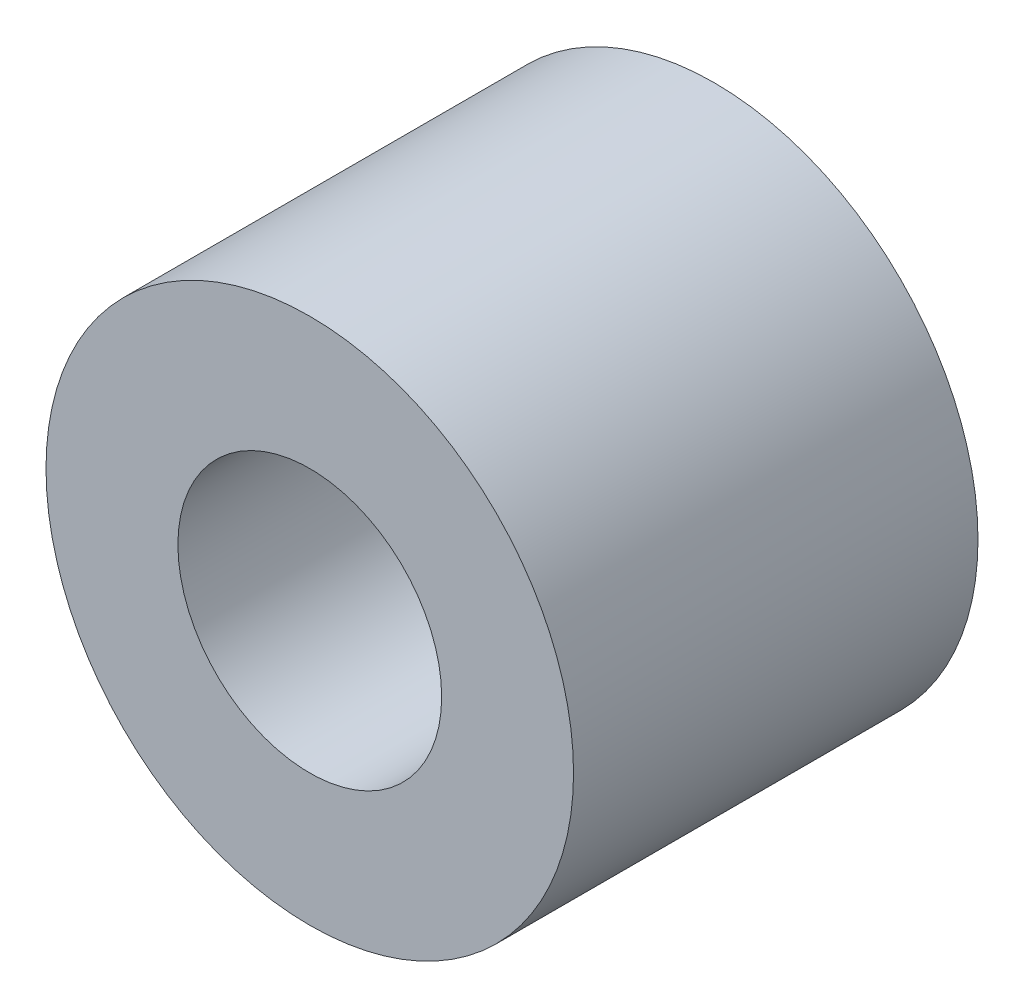
ISO-10303-21;
HEADER;
FILE_DESCRIPTION(('STEP AP214'),'2;1');
FILE_NAME('part.step','',(''),(''),'','','');
FILE_SCHEMA(('AUTOMOTIVE_DESIGN { 1 0 10303 214 1 1 1 1 }'));
ENDSEC;
DATA;
#1=APPLICATION_CONTEXT('core data for automotive mechanical design processes');
#2=APPLICATION_PROTOCOL_DEFINITION('international standard','automotive_design',2000,#1);
#3=PRODUCT_CONTEXT('',#1,'mechanical');
#4=PRODUCT('Part','Part','',(#3));
#5=PRODUCT_RELATED_PRODUCT_CATEGORY('part','',(#4));
#6=PRODUCT_DEFINITION_FORMATION('','',#4);
#7=PRODUCT_DEFINITION_CONTEXT('part definition',#1,'design');
#8=PRODUCT_DEFINITION('design','',#6,#7);
#9=PRODUCT_DEFINITION_SHAPE('','',#8);
#10=(LENGTH_UNIT() NAMED_UNIT(*) SI_UNIT(.MILLI.,.METRE.));
#11=(NAMED_UNIT(*) PLANE_ANGLE_UNIT() SI_UNIT($,.RADIAN.));
#12=(NAMED_UNIT(*) SI_UNIT($,.STERADIAN.) SOLID_ANGLE_UNIT());
#13=UNCERTAINTY_MEASURE_WITH_UNIT(LENGTH_MEASURE(1.E-05),#10,'distance_accuracy_value','');
#14=(GEOMETRIC_REPRESENTATION_CONTEXT(3) GLOBAL_UNCERTAINTY_ASSIGNED_CONTEXT((#13)) GLOBAL_UNIT_ASSIGNED_CONTEXT((#10,
#11,#12)) REPRESENTATION_CONTEXT('',''));
#15=CARTESIAN_POINT('',(0.,0.,0.));
#16=DIRECTION('',(0.,0.,1.));
#17=DIRECTION('',(1.,0.,0.));
#18=AXIS2_PLACEMENT_3D('',#15,#16,#17);
#19=CARTESIAN_POINT('',(0.,0.,6.9));
#20=DIRECTION('',(0.,0.,1.));
#21=DIRECTION('',(1.,0.,0.));
#22=AXIS2_PLACEMENT_3D('',#19,#20,#21);
#23=PLANE('',#22);
#24=CARTESIAN_POINT('',(0.,0.,6.9));
#25=DIRECTION('',(0.,0.,1.));
#26=DIRECTION('',(1.,0.,0.));
#27=AXIS2_PLACEMENT_3D('',#24,#25,#26);
#28=CIRCLE('',#27,4.5);
#29=CARTESIAN_POINT('',(-4.5,0.,6.9));
#30=VERTEX_POINT('',#29);
#31=EDGE_CURVE('E10',#30,#30,#28,.T.);
#32=ORIENTED_EDGE('',*,*,#31,.T.);
#33=EDGE_LOOP('',(#32));
#34=FACE_BOUND('',#33,.T.);
#35=CARTESIAN_POINT('',(0.,0.,6.9));
#36=DIRECTION('',(0.,0.,1.));
#37=DIRECTION('',(1.,0.,0.));
#38=AXIS2_PLACEMENT_3D('',#35,#36,#37);
#39=CIRCLE('',#38,2.25);
#40=CARTESIAN_POINT('',(-2.25,0.,6.9));
#41=VERTEX_POINT('',#40);
#42=EDGE_CURVE('E43',#41,#41,#39,.T.);
#43=ORIENTED_EDGE('',*,*,#42,.F.);
#44=EDGE_LOOP('',(#43));
#45=FACE_BOUND('',#44,.T.);
#46=ADVANCED_FACE('F32',(#34,#45),#23,.T.);
#47=CARTESIAN_POINT('',(0.,0.,0.));
#48=DIRECTION('',(0.,0.,1.));
#49=DIRECTION('',(1.,0.,0.));
#50=AXIS2_PLACEMENT_3D('',#47,#48,#49);
#51=PLANE('',#50);
#52=CARTESIAN_POINT('',(0.,0.,0.));
#53=DIRECTION('',(0.,0.,1.));
#54=DIRECTION('',(1.,0.,0.));
#55=AXIS2_PLACEMENT_3D('',#52,#53,#54);
#56=CIRCLE('',#55,4.5);
#57=CARTESIAN_POINT('',(-4.5,0.,0.));
#58=VERTEX_POINT('',#57);
#59=EDGE_CURVE('E36',#58,#58,#56,.T.);
#60=ORIENTED_EDGE('',*,*,#59,.F.);
#61=EDGE_LOOP('',(#60));
#62=FACE_BOUND('',#61,.T.);
#63=CARTESIAN_POINT('',(0.,0.,0.));
#64=DIRECTION('',(0.,0.,1.));
#65=DIRECTION('',(1.,0.,0.));
#66=AXIS2_PLACEMENT_3D('',#63,#64,#65);
#67=CIRCLE('',#66,2.25);
#68=CARTESIAN_POINT('',(-2.25,0.,0.));
#69=VERTEX_POINT('',#68);
#70=EDGE_CURVE('E45',#69,#69,#67,.T.);
#71=ORIENTED_EDGE('',*,*,#70,.T.);
#72=EDGE_LOOP('',(#71));
#73=FACE_BOUND('',#72,.T.);
#74=ADVANCED_FACE('F55',(#62,#73),#51,.F.);
#75=CARTESIAN_POINT('',(0.,0.,6.9));
#76=DIRECTION('',(0.,0.,-1.));
#77=DIRECTION('',(-1.,0.,0.));
#78=AXIS2_PLACEMENT_3D('',#75,#76,#77);
#79=CYLINDRICAL_SURFACE('',#78,4.5);
#80=CARTESIAN_POINT('',(-4.5,0.,6.9));
#81=CARTESIAN_POINT('',(-4.5,0.,6.828125));
#82=CARTESIAN_POINT('',(-4.5,0.,6.75625));
#83=CARTESIAN_POINT('',(-4.5,0.,6.6125));
#84=CARTESIAN_POINT('',(-4.5,0.,6.540625));
#85=CARTESIAN_POINT('',(-4.5,0.,6.396875));
#86=CARTESIAN_POINT('',(-4.5,0.,6.325));
#87=CARTESIAN_POINT('',(-4.5,0.,6.18125));
#88=CARTESIAN_POINT('',(-4.5,0.,6.109375));
#89=CARTESIAN_POINT('',(-4.5,0.,5.965625));
#90=CARTESIAN_POINT('',(-4.5,0.,5.89375));
#91=CARTESIAN_POINT('',(-4.5,0.,5.75));
#92=CARTESIAN_POINT('',(-4.5,0.,5.678125));
#93=CARTESIAN_POINT('',(-4.5,0.,5.534375));
#94=CARTESIAN_POINT('',(-4.5,0.,5.4625));
#95=CARTESIAN_POINT('',(-4.5,0.,5.31875));
#96=CARTESIAN_POINT('',(-4.5,0.,5.246875));
#97=CARTESIAN_POINT('',(-4.5,0.,5.103125));
#98=CARTESIAN_POINT('',(-4.5,0.,5.03125));
#99=CARTESIAN_POINT('',(-4.5,0.,4.8875));
#100=CARTESIAN_POINT('',(-4.5,0.,4.815625));
#101=CARTESIAN_POINT('',(-4.5,0.,4.671875));
#102=CARTESIAN_POINT('',(-4.5,0.,4.6));
#103=CARTESIAN_POINT('',(-4.5,0.,4.45625));
#104=CARTESIAN_POINT('',(-4.5,0.,4.384375));
#105=CARTESIAN_POINT('',(-4.5,0.,4.240625));
#106=CARTESIAN_POINT('',(-4.5,0.,4.16875));
#107=CARTESIAN_POINT('',(-4.5,0.,4.025));
#108=CARTESIAN_POINT('',(-4.5,0.,3.953125));
#109=CARTESIAN_POINT('',(-4.5,0.,3.809375));
#110=CARTESIAN_POINT('',(-4.5,0.,3.7375));
#111=CARTESIAN_POINT('',(-4.5,0.,3.59375));
#112=CARTESIAN_POINT('',(-4.5,0.,3.521875));
#113=CARTESIAN_POINT('',(-4.5,0.,3.378125));
#114=CARTESIAN_POINT('',(-4.5,0.,3.30625));
#115=CARTESIAN_POINT('',(-4.5,0.,3.1625));
#116=CARTESIAN_POINT('',(-4.5,0.,3.090625));
#117=CARTESIAN_POINT('',(-4.5,0.,2.946875));
#118=CARTESIAN_POINT('',(-4.5,0.,2.875));
#119=CARTESIAN_POINT('',(-4.5,0.,2.73125));
#120=CARTESIAN_POINT('',(-4.5,0.,2.659375));
#121=CARTESIAN_POINT('',(-4.5,0.,2.515625));
#122=CARTESIAN_POINT('',(-4.5,0.,2.44375));
#123=CARTESIAN_POINT('',(-4.5,0.,2.3));
#124=CARTESIAN_POINT('',(-4.5,0.,2.228125));
#125=CARTESIAN_POINT('',(-4.5,0.,2.084375));
#126=CARTESIAN_POINT('',(-4.5,0.,2.0125));
#127=CARTESIAN_POINT('',(-4.5,0.,1.86875));
#128=CARTESIAN_POINT('',(-4.5,0.,1.796875));
#129=CARTESIAN_POINT('',(-4.5,0.,1.653125));
#130=CARTESIAN_POINT('',(-4.5,0.,1.58125));
#131=CARTESIAN_POINT('',(-4.5,0.,1.4375));
#132=CARTESIAN_POINT('',(-4.5,0.,1.365625));
#133=CARTESIAN_POINT('',(-4.5,0.,1.221875));
#134=CARTESIAN_POINT('',(-4.5,0.,1.15));
#135=CARTESIAN_POINT('',(-4.5,0.,1.00625));
#136=CARTESIAN_POINT('',(-4.5,0.,0.934375));
#137=CARTESIAN_POINT('',(-4.5,0.,0.790625));
#138=CARTESIAN_POINT('',(-4.5,0.,0.71875));
#139=CARTESIAN_POINT('',(-4.5,0.,0.575));
#140=CARTESIAN_POINT('',(-4.5,0.,0.503125));
#141=CARTESIAN_POINT('',(-4.5,0.,0.359375));
#142=CARTESIAN_POINT('',(-4.5,0.,0.2875));
#143=CARTESIAN_POINT('',(-4.5,0.,0.14375));
#144=CARTESIAN_POINT('',(-4.5,0.,0.0718749999999998));
#145=CARTESIAN_POINT('',(-4.5,0.,0.));
#146=B_SPLINE_CURVE_WITH_KNOTS('',3,(#80,#81,#82,#83,#84,#85,#86,#87,#88,#89,#90,#91,#92,#93,
#94,#95,#96,#97,#98,#99,#100,#101,#102,#103,#104,#105,#106,#107,#108,#109,#110,#111,#112,#113,
#114,#115,#116,#117,#118,#119,#120,#121,#122,#123,#124,#125,#126,#127,#128,#129,#130,#131,#132,
#133,#134,#135,#136,#137,#138,#139,#140,#141,#142,#143,#144,#145),.UNSPECIFIED.,.F.,.F.,(4,2,2,
2,2,2,2,2,2,2,2,2,2,2,2,2,2,2,2,2,2,2,2,2,2,2,2,2,2,2,2,2,4),(0.,0.215625000000001,0.43125,
0.646875000000001,0.8625,1.078125,1.29375,1.509375,1.725,1.940625,2.15625,2.371875,2.5875,
2.803125,3.01875,3.234375,3.45,3.665625,3.88125,4.096875,4.3125,4.528125,4.74375,4.959375,5.175,
5.390625,5.60625,5.821875,6.0375,6.253125,6.46875,6.684375,6.9),.UNSPECIFIED.);
#147=EDGE_CURVE('BSEAM34',#30,#58,#146,.T.);
#148=ORIENTED_EDGE('',*,*,#31,.F.);
#149=ORIENTED_EDGE('',*,*,#59,.T.);
#150=ORIENTED_EDGE('',*,*,#147,.T.);
#151=ORIENTED_EDGE('',*,*,#147,.F.);
#152=EDGE_LOOP('',(#148,#150,#149,#151));
#153=FACE_BOUND('',#152,.T.);
#154=ADVANCED_FACE('F34',(#153),#79,.T.);
#155=CARTESIAN_POINT('',(0.,0.,6.9));
#156=DIRECTION('',(0.,0.,-1.));
#157=DIRECTION('',(-1.,0.,0.));
#158=AXIS2_PLACEMENT_3D('',#155,#156,#157);
#159=CYLINDRICAL_SURFACE('',#158,2.25);
#160=CARTESIAN_POINT('',(-2.25,0.,6.9));
#161=CARTESIAN_POINT('',(-2.25,0.,6.828125));
#162=CARTESIAN_POINT('',(-2.25,0.,6.75625));
#163=CARTESIAN_POINT('',(-2.25,0.,6.6125));
#164=CARTESIAN_POINT('',(-2.25,0.,6.540625));
#165=CARTESIAN_POINT('',(-2.25,0.,6.396875));
#166=CARTESIAN_POINT('',(-2.25,0.,6.325));
#167=CARTESIAN_POINT('',(-2.25,0.,6.18125));
#168=CARTESIAN_POINT('',(-2.25,0.,6.109375));
#169=CARTESIAN_POINT('',(-2.25,0.,5.965625));
#170=CARTESIAN_POINT('',(-2.25,0.,5.89375));
#171=CARTESIAN_POINT('',(-2.25,0.,5.75));
#172=CARTESIAN_POINT('',(-2.25,0.,5.678125));
#173=CARTESIAN_POINT('',(-2.25,0.,5.534375));
#174=CARTESIAN_POINT('',(-2.25,0.,5.4625));
#175=CARTESIAN_POINT('',(-2.25,0.,5.31875));
#176=CARTESIAN_POINT('',(-2.25,0.,5.246875));
#177=CARTESIAN_POINT('',(-2.25,0.,5.103125));
#178=CARTESIAN_POINT('',(-2.25,0.,5.03125));
#179=CARTESIAN_POINT('',(-2.25,0.,4.8875));
#180=CARTESIAN_POINT('',(-2.25,0.,4.815625));
#181=CARTESIAN_POINT('',(-2.25,0.,4.671875));
#182=CARTESIAN_POINT('',(-2.25,0.,4.6));
#183=CARTESIAN_POINT('',(-2.25,0.,4.45625));
#184=CARTESIAN_POINT('',(-2.25,0.,4.384375));
#185=CARTESIAN_POINT('',(-2.25,0.,4.240625));
#186=CARTESIAN_POINT('',(-2.25,0.,4.16875));
#187=CARTESIAN_POINT('',(-2.25,0.,4.025));
#188=CARTESIAN_POINT('',(-2.25,0.,3.953125));
#189=CARTESIAN_POINT('',(-2.25,0.,3.809375));
#190=CARTESIAN_POINT('',(-2.25,0.,3.7375));
#191=CARTESIAN_POINT('',(-2.25,0.,3.59375));
#192=CARTESIAN_POINT('',(-2.25,0.,3.521875));
#193=CARTESIAN_POINT('',(-2.25,0.,3.378125));
#194=CARTESIAN_POINT('',(-2.25,0.,3.30625));
#195=CARTESIAN_POINT('',(-2.25,0.,3.1625));
#196=CARTESIAN_POINT('',(-2.25,0.,3.090625));
#197=CARTESIAN_POINT('',(-2.25,0.,2.946875));
#198=CARTESIAN_POINT('',(-2.25,0.,2.875));
#199=CARTESIAN_POINT('',(-2.25,0.,2.73125));
#200=CARTESIAN_POINT('',(-2.25,0.,2.659375));
#201=CARTESIAN_POINT('',(-2.25,0.,2.515625));
#202=CARTESIAN_POINT('',(-2.25,0.,2.44375));
#203=CARTESIAN_POINT('',(-2.25,0.,2.3));
#204=CARTESIAN_POINT('',(-2.25,0.,2.228125));
#205=CARTESIAN_POINT('',(-2.25,0.,2.084375));
#206=CARTESIAN_POINT('',(-2.25,0.,2.0125));
#207=CARTESIAN_POINT('',(-2.25,0.,1.86875));
#208=CARTESIAN_POINT('',(-2.25,0.,1.796875));
#209=CARTESIAN_POINT('',(-2.25,0.,1.653125));
#210=CARTESIAN_POINT('',(-2.25,0.,1.58125));
#211=CARTESIAN_POINT('',(-2.25,0.,1.4375));
#212=CARTESIAN_POINT('',(-2.25,0.,1.365625));
#213=CARTESIAN_POINT('',(-2.25,0.,1.221875));
#214=CARTESIAN_POINT('',(-2.25,0.,1.15));
#215=CARTESIAN_POINT('',(-2.25,0.,1.00625));
#216=CARTESIAN_POINT('',(-2.25,0.,0.934375));
#217=CARTESIAN_POINT('',(-2.25,0.,0.790625));
#218=CARTESIAN_POINT('',(-2.25,0.,0.71875));
#219=CARTESIAN_POINT('',(-2.25,0.,0.575));
#220=CARTESIAN_POINT('',(-2.25,0.,0.503125));
#221=CARTESIAN_POINT('',(-2.25,0.,0.359375));
#222=CARTESIAN_POINT('',(-2.25,0.,0.2875));
#223=CARTESIAN_POINT('',(-2.25,0.,0.14375));
#224=CARTESIAN_POINT('',(-2.25,0.,0.0718749999999998));
#225=CARTESIAN_POINT('',(-2.25,0.,0.));
#226=B_SPLINE_CURVE_WITH_KNOTS('',3,(#160,#161,#162,#163,#164,#165,#166,#167,#168,#169,#170,
#171,#172,#173,#174,#175,#176,#177,#178,#179,#180,#181,#182,#183,#184,#185,#186,#187,#188,#189,
#190,#191,#192,#193,#194,#195,#196,#197,#198,#199,#200,#201,#202,#203,#204,#205,#206,#207,#208,
#209,#210,#211,#212,#213,#214,#215,#216,#217,#218,#219,#220,#221,#222,#223,#224,#225),
.UNSPECIFIED.,.F.,.F.,(4,2,2,2,2,2,2,2,2,2,2,2,2,2,2,2,2,2,2,2,2,2,2,2,2,2,2,2,2,2,2,2,4),(0.,
0.215625000000001,0.43125,0.646875000000001,0.8625,1.078125,1.29375,1.509375,1.725,1.940625,
2.15625,2.371875,2.5875,2.803125,3.01875,3.234375,3.45,3.665625,3.88125,4.096875,4.3125,
4.528125,4.74375,4.959375,5.175,5.390625,5.60625,5.821875,6.0375,6.253125,6.46875,6.684375,6.9),.UNSPECIFIED.);
#227=EDGE_CURVE('BSEAM51',#41,#69,#226,.T.);
#228=ORIENTED_EDGE('',*,*,#42,.T.);
#229=ORIENTED_EDGE('',*,*,#70,.F.);
#230=ORIENTED_EDGE('',*,*,#227,.T.);
#231=ORIENTED_EDGE('',*,*,#227,.F.);
#232=EDGE_LOOP('',(#228,#230,#229,#231));
#233=FACE_BOUND('',#232,.T.);
#234=ADVANCED_FACE('F51',(#233),#159,.F.);
#235=CLOSED_SHELL('',(#46,#74,#154,#234));
#236=MANIFOLD_SOLID_BREP('B2',#235);
#237=ADVANCED_BREP_SHAPE_REPRESENTATION('',(#18,#236),#14);
#238=SHAPE_DEFINITION_REPRESENTATION(#9,#237);
ENDSEC;
END-ISO-10303-21;
